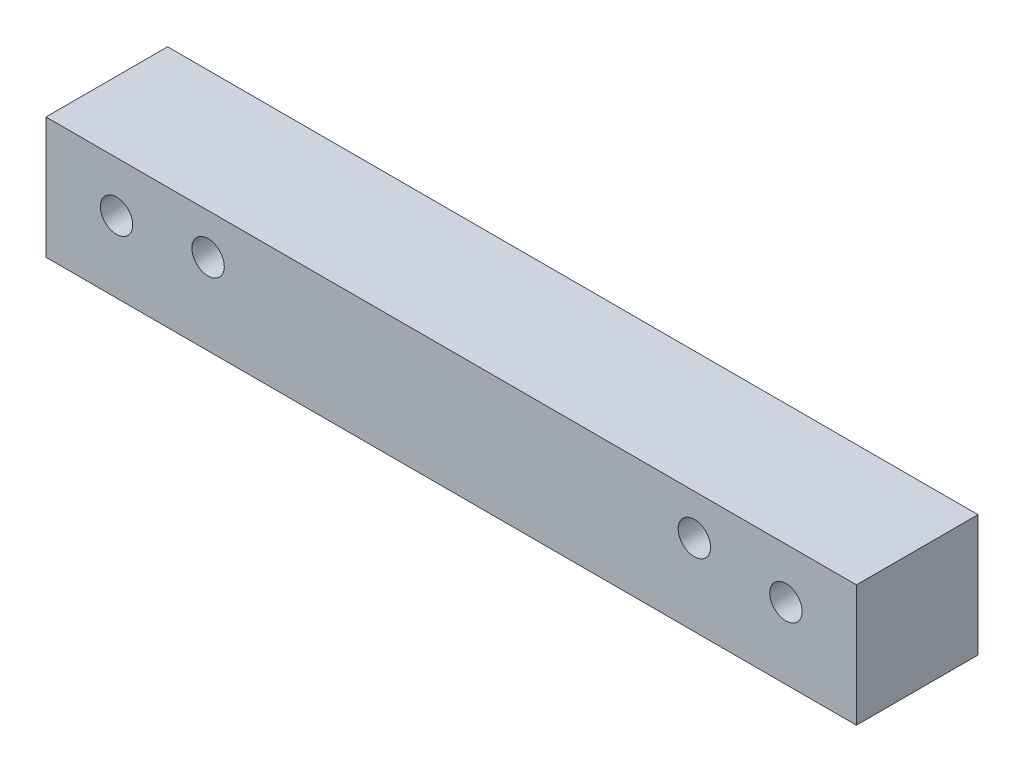
ISO-10303-21;
HEADER;
FILE_DESCRIPTION(('STEP AP214'),'2;1');
FILE_NAME('part.step','',(''),(''),'','','');
FILE_SCHEMA(('AUTOMOTIVE_DESIGN { 1 0 10303 214 1 1 1 1 }'));
ENDSEC;
DATA;
#1=APPLICATION_CONTEXT('core data for automotive mechanical design processes');
#2=APPLICATION_PROTOCOL_DEFINITION('international standard','automotive_design',2000,#1);
#3=PRODUCT_CONTEXT('',#1,'mechanical');
#4=PRODUCT('Part','Part','',(#3));
#5=PRODUCT_RELATED_PRODUCT_CATEGORY('part','',(#4));
#6=PRODUCT_DEFINITION_FORMATION('','',#4);
#7=PRODUCT_DEFINITION_CONTEXT('part definition',#1,'design');
#8=PRODUCT_DEFINITION('design','',#6,#7);
#9=PRODUCT_DEFINITION_SHAPE('','',#8);
#10=(LENGTH_UNIT() NAMED_UNIT(*) SI_UNIT(.MILLI.,.METRE.));
#11=(NAMED_UNIT(*) PLANE_ANGLE_UNIT() SI_UNIT($,.RADIAN.));
#12=(NAMED_UNIT(*) SI_UNIT($,.STERADIAN.) SOLID_ANGLE_UNIT());
#13=UNCERTAINTY_MEASURE_WITH_UNIT(LENGTH_MEASURE(1.E-05),#10,'distance_accuracy_value','');
#14=(GEOMETRIC_REPRESENTATION_CONTEXT(3) GLOBAL_UNCERTAINTY_ASSIGNED_CONTEXT((#13)) GLOBAL_UNIT_ASSIGNED_CONTEXT((#10,
#11,#12)) REPRESENTATION_CONTEXT('',''));
#15=CARTESIAN_POINT('',(0.,0.,0.));
#16=DIRECTION('',(0.,0.,1.));
#17=DIRECTION('',(1.,0.,0.));
#18=AXIS2_PLACEMENT_3D('',#15,#16,#17);
#19=CARTESIAN_POINT('',(-106.194499972541,19.05,-6.68120503597122));
#20=DIRECTION('',(1.,0.,0.));
#21=DIRECTION('',(0.,0.,-1.));
#22=AXIS2_PLACEMENT_3D('',#19,#20,#21);
#23=PLANE('',#22);
#24=DIRECTION('',(0.,0.,1.));
#25=VECTOR('',#24,1.);
#26=CARTESIAN_POINT('',(-106.194499972541,0.,-6.68120503597122));
#27=LINE('',#26,#25);
#28=CARTESIAN_POINT('',(-106.194499972541,0.,-6.68120503597122));
#29=VERTEX_POINT('',#28);
#30=CARTESIAN_POINT('',(-106.194499972541,0.,12.3687949640288));
#31=VERTEX_POINT('',#30);
#32=EDGE_CURVE('E98',#29,#31,#27,.T.);
#33=ORIENTED_EDGE('',*,*,#32,.T.);
#34=DIRECTION('',(0.,-1.,0.));
#35=VECTOR('',#34,1.);
#36=CARTESIAN_POINT('',(-106.194499972541,19.05,12.3687949640288));
#37=LINE('',#36,#35);
#38=CARTESIAN_POINT('',(-106.194499972541,19.05,12.3687949640288));
#39=VERTEX_POINT('',#38);
#40=EDGE_CURVE('E11',#39,#31,#37,.T.);
#41=ORIENTED_EDGE('',*,*,#40,.F.);
#42=DIRECTION('',(0.,0.,1.));
#43=VECTOR('',#42,1.);
#44=CARTESIAN_POINT('',(-106.194499972541,19.05,-6.68120503597122));
#45=LINE('',#44,#43);
#46=CARTESIAN_POINT('',(-106.194499972541,19.05,-6.68120503597122));
#47=VERTEX_POINT('',#46);
#48=EDGE_CURVE('E86',#47,#39,#45,.T.);
#49=ORIENTED_EDGE('',*,*,#48,.F.);
#50=DIRECTION('',(0.,-1.,0.));
#51=VECTOR('',#50,1.);
#52=CARTESIAN_POINT('',(-106.194499972541,19.05,-6.68120503597122));
#53=LINE('',#52,#51);
#54=EDGE_CURVE('E94',#47,#29,#53,.T.);
#55=ORIENTED_EDGE('',*,*,#54,.T.);
#56=EDGE_LOOP('',(#33,#41,#49,#55));
#57=FACE_BOUND('',#56,.T.);
#58=ADVANCED_FACE('F35',(#57),#23,.F.);
#59=CARTESIAN_POINT('',(-106.194499972541,19.05,12.3687949640288));
#60=DIRECTION('',(0.,0.,-1.));
#61=DIRECTION('',(-1.,0.,0.));
#62=AXIS2_PLACEMENT_3D('',#59,#60,#61);
#63=PLANE('',#62);
#64=CARTESIAN_POINT('',(9.75650002745894,11.176,12.3687949640288));
#65=DIRECTION('',(0.,0.,-1.));
#66=DIRECTION('',(-1.,0.,0.));
#67=AXIS2_PLACEMENT_3D('',#64,#65,#66);
#68=CIRCLE('',#67,2.54);
#69=CARTESIAN_POINT('',(7.21650002745894,11.176,12.3687949640288));
#70=VERTEX_POINT('',#69);
#71=EDGE_CURVE('E129',#70,#70,#68,.F.);
#72=ORIENTED_EDGE('',*,*,#71,.F.);
#73=EDGE_LOOP('',(#72));
#74=FACE_BOUND('',#73,.T.);
#75=CARTESIAN_POINT('',(-95.1454999725411,11.176,12.3687949640288));
#76=DIRECTION('',(0.,0.,-1.));
#77=DIRECTION('',(-1.,0.,0.));
#78=AXIS2_PLACEMENT_3D('',#75,#76,#77);
#79=CIRCLE('',#78,2.54);
#80=CARTESIAN_POINT('',(-97.6854999725411,11.176,12.3687949640288));
#81=VERTEX_POINT('',#80);
#82=EDGE_CURVE('E123',#81,#81,#79,.F.);
#83=ORIENTED_EDGE('',*,*,#82,.F.);
#84=EDGE_LOOP('',(#83));
#85=FACE_BOUND('',#84,.T.);
#86=CARTESIAN_POINT('',(-80.7944999725411,12.7,12.3687949640288));
#87=DIRECTION('',(0.,0.,1.));
#88=DIRECTION('',(1.,0.,0.));
#89=AXIS2_PLACEMENT_3D('',#86,#87,#88);
#90=CIRCLE('',#89,2.54);
#91=CARTESIAN_POINT('',(-78.2544999725411,12.7,12.3687949640288));
#92=VERTEX_POINT('',#91);
#93=EDGE_CURVE('E120',#92,#92,#90,.T.);
#94=ORIENTED_EDGE('',*,*,#93,.F.);
#95=EDGE_LOOP('',(#94));
#96=FACE_BOUND('',#95,.T.);
#97=CARTESIAN_POINT('',(-4.59449997254104,12.7,12.3687949640288));
#98=DIRECTION('',(0.,0.,1.));
#99=DIRECTION('',(1.,0.,0.));
#100=AXIS2_PLACEMENT_3D('',#97,#98,#99);
#101=CIRCLE('',#100,2.53999999999999);
#102=CARTESIAN_POINT('',(-2.05449997254104,12.7,12.3687949640288));
#103=VERTEX_POINT('',#102);
#104=EDGE_CURVE('E114',#103,#103,#101,.T.);
#105=ORIENTED_EDGE('',*,*,#104,.F.);
#106=EDGE_LOOP('',(#105));
#107=FACE_BOUND('',#106,.T.);
#108=DIRECTION('',(1.,0.,0.));
#109=VECTOR('',#108,1.);
#110=CARTESIAN_POINT('',(-106.194499972541,0.,12.3687949640288));
#111=LINE('',#110,#109);
#112=CARTESIAN_POINT('',(20.8055000274589,0.,12.3687949640288));
#113=VERTEX_POINT('',#112);
#114=EDGE_CURVE('E90',#31,#113,#111,.T.);
#115=ORIENTED_EDGE('',*,*,#114,.T.);
#116=DIRECTION('',(0.,-1.,0.));
#117=VECTOR('',#116,1.);
#118=CARTESIAN_POINT('',(20.8055000274589,19.05,12.3687949640288));
#119=LINE('',#118,#117);
#120=CARTESIAN_POINT('',(20.8055000274589,19.05,12.3687949640288));
#121=VERTEX_POINT('',#120);
#122=EDGE_CURVE('E43',#121,#113,#119,.T.);
#123=ORIENTED_EDGE('',*,*,#122,.F.);
#124=DIRECTION('',(1.,0.,0.));
#125=VECTOR('',#124,1.);
#126=CARTESIAN_POINT('',(-106.194499972541,19.05,12.3687949640288));
#127=LINE('',#126,#125);
#128=EDGE_CURVE('E81',#39,#121,#127,.T.);
#129=ORIENTED_EDGE('',*,*,#128,.F.);
#130=ORIENTED_EDGE('',*,*,#40,.T.);
#131=EDGE_LOOP('',(#115,#123,#129,#130));
#132=FACE_BOUND('',#131,.T.);
#133=ADVANCED_FACE('F89',(#74,#85,#96,#107,#132),#63,.F.);
#134=CARTESIAN_POINT('',(20.8055000274589,19.05,-6.68120503597122));
#135=DIRECTION('',(-1.,0.,0.));
#136=DIRECTION('',(0.,0.,1.));
#137=AXIS2_PLACEMENT_3D('',#134,#135,#136);
#138=PLANE('',#137);
#139=DIRECTION('',(0.,0.,-1.));
#140=VECTOR('',#139,1.);
#141=CARTESIAN_POINT('',(20.8055000274589,0.,-6.68120503597122));
#142=LINE('',#141,#140);
#143=CARTESIAN_POINT('',(20.8055000274589,0.,-6.68120503597122));
#144=VERTEX_POINT('',#143);
#145=EDGE_CURVE('E68',#113,#144,#142,.T.);
#146=ORIENTED_EDGE('',*,*,#145,.T.);
#147=DIRECTION('',(0.,-1.,0.));
#148=VECTOR('',#147,1.);
#149=CARTESIAN_POINT('',(20.8055000274589,19.05,-6.68120503597122));
#150=LINE('',#149,#148);
#151=CARTESIAN_POINT('',(20.8055000274589,19.05,-6.68120503597122));
#152=VERTEX_POINT('',#151);
#153=EDGE_CURVE('E91',#152,#144,#150,.T.);
#154=ORIENTED_EDGE('',*,*,#153,.F.);
#155=DIRECTION('',(0.,0.,-1.));
#156=VECTOR('',#155,1.);
#157=CARTESIAN_POINT('',(20.8055000274589,19.05,-6.68120503597122));
#158=LINE('',#157,#156);
#159=EDGE_CURVE('E84',#121,#152,#158,.T.);
#160=ORIENTED_EDGE('',*,*,#159,.F.);
#161=ORIENTED_EDGE('',*,*,#122,.T.);
#162=EDGE_LOOP('',(#146,#154,#160,#161));
#163=FACE_BOUND('',#162,.T.);
#164=ADVANCED_FACE('F92',(#163),#138,.F.);
#165=CARTESIAN_POINT('',(-106.194499972541,19.05,-6.68120503597122));
#166=DIRECTION('',(0.,0.,1.));
#167=DIRECTION('',(1.,0.,0.));
#168=AXIS2_PLACEMENT_3D('',#165,#166,#167);
#169=PLANE('',#168);
#170=CARTESIAN_POINT('',(9.75650002745894,11.176,-6.68120503597122));
#171=DIRECTION('',(0.,0.,-1.));
#172=DIRECTION('',(-1.,0.,0.));
#173=AXIS2_PLACEMENT_3D('',#170,#171,#172);
#174=CIRCLE('',#173,2.54);
#175=CARTESIAN_POINT('',(7.21650002745894,11.176,-6.68120503597122));
#176=VERTEX_POINT('',#175);
#177=EDGE_CURVE('E132',#176,#176,#174,.T.);
#178=ORIENTED_EDGE('',*,*,#177,.F.);
#179=EDGE_LOOP('',(#178));
#180=FACE_BOUND('',#179,.T.);
#181=CARTESIAN_POINT('',(-95.1454999725411,11.176,-6.68120503597122));
#182=DIRECTION('',(0.,0.,-1.));
#183=DIRECTION('',(-1.,0.,0.));
#184=AXIS2_PLACEMENT_3D('',#181,#182,#183);
#185=CIRCLE('',#184,2.54);
#186=CARTESIAN_POINT('',(-97.6854999725411,11.176,-6.68120503597122));
#187=VERTEX_POINT('',#186);
#188=EDGE_CURVE('E126',#187,#187,#185,.T.);
#189=ORIENTED_EDGE('',*,*,#188,.F.);
#190=EDGE_LOOP('',(#189));
#191=FACE_BOUND('',#190,.T.);
#192=CARTESIAN_POINT('',(-80.7944999725411,12.7,-6.68120503597122));
#193=DIRECTION('',(0.,0.,1.));
#194=DIRECTION('',(1.,0.,0.));
#195=AXIS2_PLACEMENT_3D('',#192,#193,#194);
#196=CIRCLE('',#195,2.54);
#197=CARTESIAN_POINT('',(-78.2544999725411,12.7,-6.68120503597122));
#198=VERTEX_POINT('',#197);
#199=EDGE_CURVE('E117',#198,#198,#196,.F.);
#200=ORIENTED_EDGE('',*,*,#199,.F.);
#201=EDGE_LOOP('',(#200));
#202=FACE_BOUND('',#201,.T.);
#203=CARTESIAN_POINT('',(-4.59449997254104,12.7,-6.68120503597122));
#204=DIRECTION('',(0.,0.,1.));
#205=DIRECTION('',(1.,0.,0.));
#206=AXIS2_PLACEMENT_3D('',#203,#204,#205);
#207=CIRCLE('',#206,2.53999999999999);
#208=CARTESIAN_POINT('',(-2.05449997254104,12.7,-6.68120503597122));
#209=VERTEX_POINT('',#208);
#210=EDGE_CURVE('E101',#209,#209,#207,.F.);
#211=ORIENTED_EDGE('',*,*,#210,.F.);
#212=EDGE_LOOP('',(#211));
#213=FACE_BOUND('',#212,.T.);
#214=DIRECTION('',(-1.,0.,0.));
#215=VECTOR('',#214,1.);
#216=CARTESIAN_POINT('',(-106.194499972541,0.,-6.68120503597122));
#217=LINE('',#216,#215);
#218=EDGE_CURVE('E74',#144,#29,#217,.T.);
#219=ORIENTED_EDGE('',*,*,#218,.T.);
#220=ORIENTED_EDGE('',*,*,#54,.F.);
#221=DIRECTION('',(-1.,0.,0.));
#222=VECTOR('',#221,1.);
#223=CARTESIAN_POINT('',(-106.194499972541,19.05,-6.68120503597122));
#224=LINE('',#223,#222);
#225=EDGE_CURVE('E51',#152,#47,#224,.T.);
#226=ORIENTED_EDGE('',*,*,#225,.F.);
#227=ORIENTED_EDGE('',*,*,#153,.T.);
#228=EDGE_LOOP('',(#219,#220,#226,#227));
#229=FACE_BOUND('',#228,.T.);
#230=ADVANCED_FACE('F106',(#180,#191,#202,#213,#229),#169,.F.);
#231=CARTESIAN_POINT('',(0.,19.05,0.));
#232=DIRECTION('',(0.,1.,0.));
#233=DIRECTION('',(0.,0.,1.));
#234=AXIS2_PLACEMENT_3D('',#231,#232,#233);
#235=PLANE('',#234);
#236=ORIENTED_EDGE('',*,*,#48,.T.);
#237=ORIENTED_EDGE('',*,*,#128,.T.);
#238=ORIENTED_EDGE('',*,*,#159,.T.);
#239=ORIENTED_EDGE('',*,*,#225,.T.);
#240=EDGE_LOOP('',(#236,#237,#238,#239));
#241=FACE_BOUND('',#240,.T.);
#242=ADVANCED_FACE('F82',(#241),#235,.T.);
#243=CARTESIAN_POINT('',(0.,0.,0.));
#244=DIRECTION('',(0.,1.,0.));
#245=DIRECTION('',(0.,0.,1.));
#246=AXIS2_PLACEMENT_3D('',#243,#244,#245);
#247=PLANE('',#246);
#248=ORIENTED_EDGE('',*,*,#32,.F.);
#249=ORIENTED_EDGE('',*,*,#218,.F.);
#250=ORIENTED_EDGE('',*,*,#145,.F.);
#251=ORIENTED_EDGE('',*,*,#114,.F.);
#252=EDGE_LOOP('',(#248,#249,#250,#251));
#253=FACE_BOUND('',#252,.T.);
#254=ADVANCED_FACE('F109',(#253),#247,.F.);
#255=CARTESIAN_POINT('',(-4.59449997254104,12.7,-6.68220503597122));
#256=DIRECTION('',(0.,0.,1.));
#257=DIRECTION('',(1.,0.,0.));
#258=AXIS2_PLACEMENT_3D('',#255,#256,#257);
#259=CYLINDRICAL_SURFACE('',#258,2.53999999999999);
#260=ORIENTED_EDGE('',*,*,#104,.T.);
#261=EDGE_LOOP('',(#260));
#262=FACE_BOUND('',#261,.T.);
#263=ORIENTED_EDGE('',*,*,#210,.T.);
#264=EDGE_LOOP('',(#263));
#265=FACE_BOUND('',#264,.T.);
#266=ADVANCED_FACE('F148',(#262,#265),#259,.F.);
#267=CARTESIAN_POINT('',(-80.7944999725411,12.7,-6.68220503597122));
#268=DIRECTION('',(0.,0.,1.));
#269=DIRECTION('',(1.,0.,0.));
#270=AXIS2_PLACEMENT_3D('',#267,#268,#269);
#271=CYLINDRICAL_SURFACE('',#270,2.54);
#272=ORIENTED_EDGE('',*,*,#93,.T.);
#273=EDGE_LOOP('',(#272));
#274=FACE_BOUND('',#273,.T.);
#275=ORIENTED_EDGE('',*,*,#199,.T.);
#276=EDGE_LOOP('',(#275));
#277=FACE_BOUND('',#276,.T.);
#278=ADVANCED_FACE('F150',(#274,#277),#271,.F.);
#279=CARTESIAN_POINT('',(-95.1454999725411,11.176,12.3697949640288));
#280=DIRECTION('',(0.,0.,-1.));
#281=DIRECTION('',(-1.,0.,0.));
#282=AXIS2_PLACEMENT_3D('',#279,#280,#281);
#283=CYLINDRICAL_SURFACE('',#282,2.54);
#284=ORIENTED_EDGE('',*,*,#188,.T.);
#285=EDGE_LOOP('',(#284));
#286=FACE_BOUND('',#285,.T.);
#287=ORIENTED_EDGE('',*,*,#82,.T.);
#288=EDGE_LOOP('',(#287));
#289=FACE_BOUND('',#288,.T.);
#290=ADVANCED_FACE('F157',(#286,#289),#283,.F.);
#291=CARTESIAN_POINT('',(9.75650002745894,11.176,12.3697949640288));
#292=DIRECTION('',(0.,0.,-1.));
#293=DIRECTION('',(-1.,0.,0.));
#294=AXIS2_PLACEMENT_3D('',#291,#292,#293);
#295=CYLINDRICAL_SURFACE('',#294,2.54);
#296=ORIENTED_EDGE('',*,*,#177,.T.);
#297=EDGE_LOOP('',(#296));
#298=FACE_BOUND('',#297,.T.);
#299=ORIENTED_EDGE('',*,*,#71,.T.);
#300=EDGE_LOOP('',(#299));
#301=FACE_BOUND('',#300,.T.);
#302=ADVANCED_FACE('F136',(#298,#301),#295,.F.);
#303=CLOSED_SHELL('',(#58,#133,#164,#230,#242,#254,#266,#278,#290,#302));
#304=MANIFOLD_SOLID_BREP('B2',#303);
#305=ADVANCED_BREP_SHAPE_REPRESENTATION('',(#18,#304),#14);
#306=SHAPE_DEFINITION_REPRESENTATION(#9,#305);
ENDSEC;
END-ISO-10303-21;
